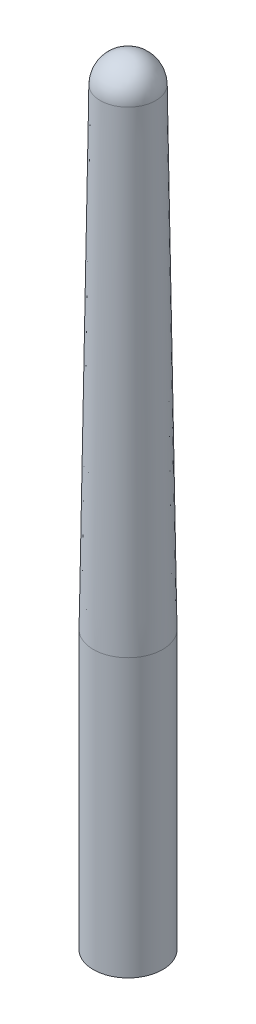
ISO-10303-21;
HEADER;
FILE_DESCRIPTION(('STEP AP214'),'2;1');
FILE_NAME('part.step','',(''),(''),'','','');
FILE_SCHEMA(('AUTOMOTIVE_DESIGN { 1 0 10303 214 1 1 1 1 }'));
ENDSEC;
DATA;
#1=APPLICATION_CONTEXT('core data for automotive mechanical design processes');
#2=APPLICATION_PROTOCOL_DEFINITION('international standard','automotive_design',2000,#1);
#3=PRODUCT_CONTEXT('',#1,'mechanical');
#4=PRODUCT('Part','Part','',(#3));
#5=PRODUCT_RELATED_PRODUCT_CATEGORY('part','',(#4));
#6=PRODUCT_DEFINITION_FORMATION('','',#4);
#7=PRODUCT_DEFINITION_CONTEXT('part definition',#1,'design');
#8=PRODUCT_DEFINITION('design','',#6,#7);
#9=PRODUCT_DEFINITION_SHAPE('','',#8);
#10=(LENGTH_UNIT() NAMED_UNIT(*) SI_UNIT(.MILLI.,.METRE.));
#11=(NAMED_UNIT(*) PLANE_ANGLE_UNIT() SI_UNIT($,.RADIAN.));
#12=(NAMED_UNIT(*) SI_UNIT($,.STERADIAN.) SOLID_ANGLE_UNIT());
#13=UNCERTAINTY_MEASURE_WITH_UNIT(LENGTH_MEASURE(1.E-05),#10,'distance_accuracy_value','');
#14=(GEOMETRIC_REPRESENTATION_CONTEXT(3) GLOBAL_UNCERTAINTY_ASSIGNED_CONTEXT((#13)) GLOBAL_UNIT_ASSIGNED_CONTEXT((#10,
#11,#12)) REPRESENTATION_CONTEXT('',''));
#15=CARTESIAN_POINT('',(0.,0.,0.));
#16=DIRECTION('',(0.,0.,1.));
#17=DIRECTION('',(1.,0.,0.));
#18=AXIS2_PLACEMENT_3D('',#15,#16,#17);
#19=CARTESIAN_POINT('',(-5.,0.,0.));
#20=DIRECTION('',(0.,1.,0.));
#21=DIRECTION('',(0.,0.,1.));
#22=AXIS2_PLACEMENT_3D('',#19,#20,#21);
#23=PLANE('',#22);
#24=CARTESIAN_POINT('',(0.,0.,0.));
#25=DIRECTION('',(0.,-1.,0.));
#26=DIRECTION('',(0.,0.,-1.));
#27=AXIS2_PLACEMENT_3D('',#24,#25,#26);
#28=CIRCLE('',#27,5.);
#29=CARTESIAN_POINT('',(0.,0.,-5.));
#30=VERTEX_POINT('',#29);
#31=EDGE_CURVE('E47',#30,#30,#28,.T.);
#32=ORIENTED_EDGE('',*,*,#31,.T.);
#33=EDGE_LOOP('',(#32));
#34=FACE_BOUND('',#33,.T.);
#35=ADVANCED_FACE('F34',(#34),#23,.F.);
#36=CARTESIAN_POINT('',(0.,108.,0.));
#37=DIRECTION('',(0.,-1.,0.));
#38=DIRECTION('',(-1.,0.,0.));
#39=AXIS2_PLACEMENT_3D('',#36,#37,#38);
#40=SPHERICAL_SURFACE('',#39,4.);
#41=CARTESIAN_POINT('',(0.,108.058791758662,0.));
#42=DIRECTION('',(0.,-1.,0.));
#43=DIRECTION('',(0.,0.,-1.));
#44=AXIS2_PLACEMENT_3D('',#41,#42,#43);
#45=CIRCLE('',#44,3.9995679178023);
#46=CARTESIAN_POINT('',(0.,108.058791758662,-3.9995679178023));
#47=VERTEX_POINT('',#46);
#48=EDGE_CURVE('E10',#47,#47,#45,.T.);
#49=ORIENTED_EDGE('',*,*,#48,.F.);
#50=EDGE_LOOP('',(#49));
#51=FACE_BOUND('',#50,.T.);
#52=ADVANCED_FACE('F62',(#51),#40,.T.);
#53=CARTESIAN_POINT('',(0.,108.058791758662,0.));
#54=DIRECTION('',(0.,-1.,0.));
#55=DIRECTION('',(0.,0.,-1.));
#56=AXIS2_PLACEMENT_3D('',#53,#54,#55);
#57=CONICAL_SURFACE('',#56,3.9995679178023,0.0146984689148575);
#58=CARTESIAN_POINT('',(0.,40.,0.));
#59=DIRECTION('',(0.,-1.,0.));
#60=DIRECTION('',(0.,0.,-1.));
#61=AXIS2_PLACEMENT_3D('',#58,#59,#60);
#62=CIRCLE('',#61,5.);
#63=CARTESIAN_POINT('',(0.,40.,-5.));
#64=VERTEX_POINT('',#63);
#65=EDGE_CURVE('E41',#64,#64,#62,.T.);
#66=ORIENTED_EDGE('',*,*,#65,.F.);
#67=EDGE_LOOP('',(#66));
#68=FACE_BOUND('',#67,.T.);
#69=ORIENTED_EDGE('',*,*,#48,.T.);
#70=EDGE_LOOP('',(#69));
#71=FACE_BOUND('',#70,.T.);
#72=ADVANCED_FACE('F57',(#68,#71),#57,.T.);
#73=CARTESIAN_POINT('',(0.,0.,0.));
#74=DIRECTION('',(0.,-1.,0.));
#75=DIRECTION('',(0.,0.,-1.));
#76=AXIS2_PLACEMENT_3D('',#73,#74,#75);
#77=CYLINDRICAL_SURFACE('',#76,5.);
#78=ORIENTED_EDGE('',*,*,#31,.F.);
#79=EDGE_LOOP('',(#78));
#80=FACE_BOUND('',#79,.T.);
#81=ORIENTED_EDGE('',*,*,#65,.T.);
#82=EDGE_LOOP('',(#81));
#83=FACE_BOUND('',#82,.T.);
#84=ADVANCED_FACE('F55',(#80,#83),#77,.T.);
#85=CLOSED_SHELL('',(#35,#52,#72,#84));
#86=MANIFOLD_SOLID_BREP('B2',#85);
#87=ADVANCED_BREP_SHAPE_REPRESENTATION('',(#18,#86),#14);
#88=SHAPE_DEFINITION_REPRESENTATION(#9,#87);
ENDSEC;
END-ISO-10303-21;
